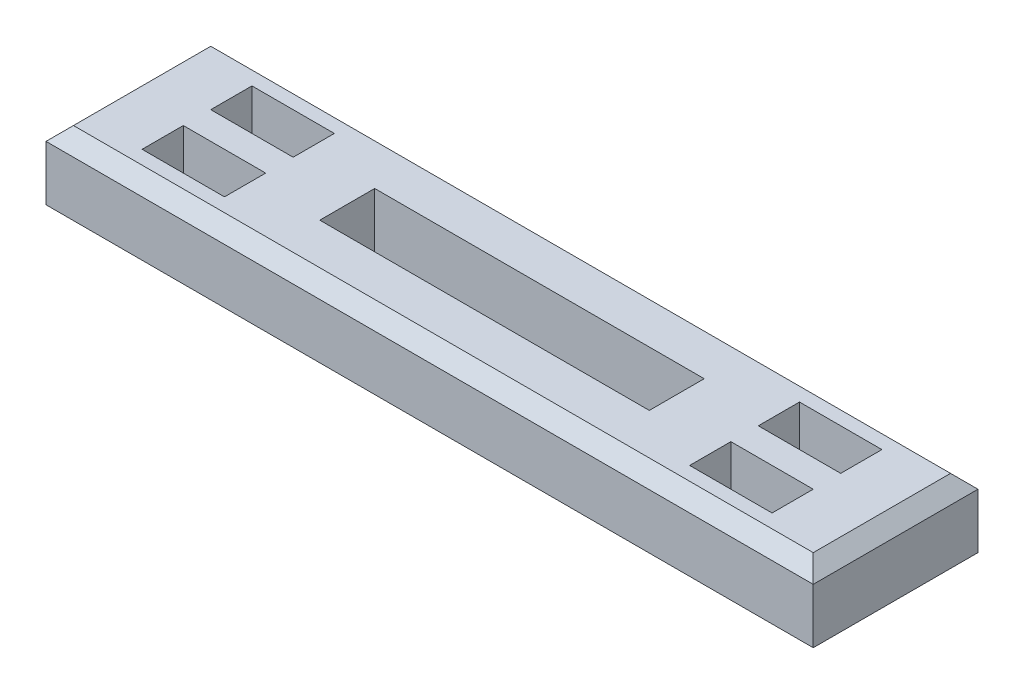
ISO-10303-21;
HEADER;
FILE_DESCRIPTION(('STEP AP214'),'2;1');
FILE_NAME('part.step','',(''),(''),'','','');
FILE_SCHEMA(('AUTOMOTIVE_DESIGN { 1 0 10303 214 1 1 1 1 }'));
ENDSEC;
DATA;
#1=APPLICATION_CONTEXT('core data for automotive mechanical design processes');
#2=APPLICATION_PROTOCOL_DEFINITION('international standard','automotive_design',2000,#1);
#3=PRODUCT_CONTEXT('',#1,'mechanical');
#4=PRODUCT('Part','Part','',(#3));
#5=PRODUCT_RELATED_PRODUCT_CATEGORY('part','',(#4));
#6=PRODUCT_DEFINITION_FORMATION('','',#4);
#7=PRODUCT_DEFINITION_CONTEXT('part definition',#1,'design');
#8=PRODUCT_DEFINITION('design','',#6,#7);
#9=PRODUCT_DEFINITION_SHAPE('','',#8);
#10=(LENGTH_UNIT() NAMED_UNIT(*) SI_UNIT(.MILLI.,.METRE.));
#11=(NAMED_UNIT(*) PLANE_ANGLE_UNIT() SI_UNIT($,.RADIAN.));
#12=(NAMED_UNIT(*) SI_UNIT($,.STERADIAN.) SOLID_ANGLE_UNIT());
#13=UNCERTAINTY_MEASURE_WITH_UNIT(LENGTH_MEASURE(1.E-05),#10,'distance_accuracy_value','');
#14=(GEOMETRIC_REPRESENTATION_CONTEXT(3) GLOBAL_UNCERTAINTY_ASSIGNED_CONTEXT((#13)) GLOBAL_UNIT_ASSIGNED_CONTEXT((#10,
#11,#12)) REPRESENTATION_CONTEXT('',''));
#15=CARTESIAN_POINT('',(0.,0.,0.));
#16=DIRECTION('',(0.,0.,1.));
#17=DIRECTION('',(1.,0.,0.));
#18=AXIS2_PLACEMENT_3D('',#15,#16,#17);
#19=CARTESIAN_POINT('',(-13.97,1.5,6.));
#20=DIRECTION('',(0.,-1.,0.));
#21=DIRECTION('',(0.,0.,-1.));
#22=AXIS2_PLACEMENT_3D('',#19,#20,#21);
#23=PLANE('',#22);
#24=DIRECTION('',(1.,0.,0.));
#25=VECTOR('',#24,1.);
#26=CARTESIAN_POINT('',(6.,1.5,4.));
#27=LINE('',#26,#25);
#28=CARTESIAN_POINT('',(-6.,1.5,4.));
#29=VERTEX_POINT('',#28);
#30=CARTESIAN_POINT('',(6.,1.5,4.));
#31=VERTEX_POINT('',#30);
#32=EDGE_CURVE('E248',#29,#31,#27,.T.);
#33=ORIENTED_EDGE('',*,*,#32,.F.);
#34=DIRECTION('',(0.,0.,1.));
#35=VECTOR('',#34,1.);
#36=CARTESIAN_POINT('',(-6.,1.5,2.));
#37=LINE('',#36,#35);
#38=CARTESIAN_POINT('',(-6.,1.5,2.));
#39=VERTEX_POINT('',#38);
#40=EDGE_CURVE('E52',#39,#29,#37,.T.);
#41=ORIENTED_EDGE('',*,*,#40,.F.);
#42=DIRECTION('',(-1.,0.,0.));
#43=VECTOR('',#42,1.);
#44=CARTESIAN_POINT('',(6.,1.5,2.));
#45=LINE('',#44,#43);
#46=CARTESIAN_POINT('',(6.,1.5,2.));
#47=VERTEX_POINT('',#46);
#48=EDGE_CURVE('E239',#47,#39,#45,.T.);
#49=ORIENTED_EDGE('',*,*,#48,.F.);
#50=DIRECTION('',(0.,0.,-1.));
#51=VECTOR('',#50,1.);
#52=CARTESIAN_POINT('',(6.,1.5,2.));
#53=LINE('',#52,#51);
#54=EDGE_CURVE('E242',#31,#47,#53,.T.);
#55=ORIENTED_EDGE('',*,*,#54,.F.);
#56=EDGE_LOOP('',(#33,#41,#49,#55));
#57=FACE_BOUND('',#56,.T.);
#58=DIRECTION('',(1.,0.,0.));
#59=VECTOR('',#58,1.);
#60=CARTESIAN_POINT('',(13.97,1.5,5.5));
#61=LINE('',#60,#59);
#62=CARTESIAN_POINT('',(-13.47,1.5,5.5));
#63=VERTEX_POINT('',#62);
#64=CARTESIAN_POINT('',(13.47,1.5,5.5));
#65=VERTEX_POINT('',#64);
#66=EDGE_CURVE('E399',#63,#65,#61,.T.);
#67=ORIENTED_EDGE('',*,*,#66,.T.);
#68=DIRECTION('',(0.,0.,-1.));
#69=VECTOR('',#68,1.);
#70=CARTESIAN_POINT('',(13.47,1.5,6.));
#71=LINE('',#70,#69);
#72=CARTESIAN_POINT('',(13.47,1.5,0.500000000000004));
#73=VERTEX_POINT('',#72);
#74=EDGE_CURVE('E401',#65,#73,#71,.T.);
#75=ORIENTED_EDGE('',*,*,#74,.T.);
#76=DIRECTION('',(-1.,0.,0.));
#77=VECTOR('',#76,1.);
#78=CARTESIAN_POINT('',(-13.97,1.5,0.500000000000004));
#79=LINE('',#78,#77);
#80=CARTESIAN_POINT('',(-13.47,1.5,0.500000000000004));
#81=VERTEX_POINT('',#80);
#82=EDGE_CURVE('E397',#73,#81,#79,.T.);
#83=ORIENTED_EDGE('',*,*,#82,.T.);
#84=DIRECTION('',(0.,0.,1.));
#85=VECTOR('',#84,1.);
#86=CARTESIAN_POINT('',(-13.47,1.5,6.));
#87=LINE('',#86,#85);
#88=EDGE_CURVE('E395',#81,#63,#87,.T.);
#89=ORIENTED_EDGE('',*,*,#88,.T.);
#90=EDGE_LOOP('',(#67,#75,#83,#89));
#91=FACE_BOUND('',#90,.T.);
#92=DIRECTION('',(-1.,0.,0.));
#93=VECTOR('',#92,1.);
#94=CARTESIAN_POINT('',(0.,1.5,5.));
#95=LINE('',#94,#93);
#96=CARTESIAN_POINT('',(11.47,1.5,5.));
#97=VERTEX_POINT('',#96);
#98=CARTESIAN_POINT('',(8.47,1.5,5.));
#99=VERTEX_POINT('',#98);
#100=EDGE_CURVE('E274',#97,#99,#95,.T.);
#101=ORIENTED_EDGE('',*,*,#100,.T.);
#102=DIRECTION('',(0.,0.,-1.));
#103=VECTOR('',#102,1.);
#104=CARTESIAN_POINT('',(8.47,1.5,0.));
#105=LINE('',#104,#103);
#106=CARTESIAN_POINT('',(8.47,1.5,3.5));
#107=VERTEX_POINT('',#106);
#108=EDGE_CURVE('E289',#99,#107,#105,.T.);
#109=ORIENTED_EDGE('',*,*,#108,.T.);
#110=DIRECTION('',(1.,0.,0.));
#111=VECTOR('',#110,1.);
#112=CARTESIAN_POINT('',(0.,1.5,3.5));
#113=LINE('',#112,#111);
#114=CARTESIAN_POINT('',(11.47,1.5,3.5));
#115=VERTEX_POINT('',#114);
#116=EDGE_CURVE('E286',#107,#115,#113,.T.);
#117=ORIENTED_EDGE('',*,*,#116,.T.);
#118=DIRECTION('',(0.,0.,-1.));
#119=VECTOR('',#118,1.);
#120=CARTESIAN_POINT('',(11.47,1.5,0.));
#121=LINE('',#120,#119);
#122=EDGE_CURVE('E283',#97,#115,#121,.T.);
#123=ORIENTED_EDGE('',*,*,#122,.F.);
#124=EDGE_LOOP('',(#101,#109,#117,#123));
#125=FACE_BOUND('',#124,.T.);
#126=DIRECTION('',(-1.,0.,0.));
#127=VECTOR('',#126,1.);
#128=CARTESIAN_POINT('',(0.,1.5,3.5));
#129=LINE('',#128,#127);
#130=CARTESIAN_POINT('',(-8.47,1.5,3.5));
#131=VERTEX_POINT('',#130);
#132=CARTESIAN_POINT('',(-11.47,1.5,3.5));
#133=VERTEX_POINT('',#132);
#134=EDGE_CURVE('E303',#131,#133,#129,.T.);
#135=ORIENTED_EDGE('',*,*,#134,.F.);
#136=DIRECTION('',(0.,0.,-1.));
#137=VECTOR('',#136,1.);
#138=CARTESIAN_POINT('',(-8.47,1.5,0.));
#139=LINE('',#138,#137);
#140=CARTESIAN_POINT('',(-8.47,1.5,5.));
#141=VERTEX_POINT('',#140);
#142=EDGE_CURVE('E295',#141,#131,#139,.T.);
#143=ORIENTED_EDGE('',*,*,#142,.F.);
#144=DIRECTION('',(1.,0.,0.));
#145=VECTOR('',#144,1.);
#146=CARTESIAN_POINT('',(0.,1.5,5.));
#147=LINE('',#146,#145);
#148=CARTESIAN_POINT('',(-11.47,1.5,5.));
#149=VERTEX_POINT('',#148);
#150=EDGE_CURVE('E309',#149,#141,#147,.T.);
#151=ORIENTED_EDGE('',*,*,#150,.F.);
#152=DIRECTION('',(0.,0.,-1.));
#153=VECTOR('',#152,1.);
#154=CARTESIAN_POINT('',(-11.47,1.5,0.));
#155=LINE('',#154,#153);
#156=EDGE_CURVE('E306',#149,#133,#155,.T.);
#157=ORIENTED_EDGE('',*,*,#156,.T.);
#158=EDGE_LOOP('',(#135,#143,#151,#157));
#159=FACE_BOUND('',#158,.T.);
#160=DIRECTION('',(-1.,0.,0.));
#161=VECTOR('',#160,1.);
#162=CARTESIAN_POINT('',(0.,1.5,0.999999999999999));
#163=LINE('',#162,#161);
#164=CARTESIAN_POINT('',(-8.47,1.5,1.));
#165=VERTEX_POINT('',#164);
#166=CARTESIAN_POINT('',(-11.47,1.5,1.));
#167=VERTEX_POINT('',#166);
#168=EDGE_CURVE('E323',#165,#167,#163,.T.);
#169=ORIENTED_EDGE('',*,*,#168,.F.);
#170=DIRECTION('',(0.,0.,-1.));
#171=VECTOR('',#170,1.);
#172=CARTESIAN_POINT('',(-8.47,1.5,0.));
#173=LINE('',#172,#171);
#174=CARTESIAN_POINT('',(-8.47,1.5,2.5));
#175=VERTEX_POINT('',#174);
#176=EDGE_CURVE('E315',#175,#165,#173,.T.);
#177=ORIENTED_EDGE('',*,*,#176,.F.);
#178=DIRECTION('',(1.,0.,0.));
#179=VECTOR('',#178,1.);
#180=CARTESIAN_POINT('',(0.,1.5,2.5));
#181=LINE('',#180,#179);
#182=CARTESIAN_POINT('',(-11.47,1.5,2.5));
#183=VERTEX_POINT('',#182);
#184=EDGE_CURVE('E329',#183,#175,#181,.T.);
#185=ORIENTED_EDGE('',*,*,#184,.F.);
#186=DIRECTION('',(0.,0.,-1.));
#187=VECTOR('',#186,1.);
#188=CARTESIAN_POINT('',(-11.47,1.5,0.));
#189=LINE('',#188,#187);
#190=EDGE_CURVE('E326',#183,#167,#189,.T.);
#191=ORIENTED_EDGE('',*,*,#190,.T.);
#192=EDGE_LOOP('',(#169,#177,#185,#191));
#193=FACE_BOUND('',#192,.T.);
#194=DIRECTION('',(-1.,0.,0.));
#195=VECTOR('',#194,1.);
#196=CARTESIAN_POINT('',(0.,1.5,2.5));
#197=LINE('',#196,#195);
#198=CARTESIAN_POINT('',(11.47,1.5,2.5));
#199=VERTEX_POINT('',#198);
#200=CARTESIAN_POINT('',(8.47,1.5,2.5));
#201=VERTEX_POINT('',#200);
#202=EDGE_CURVE('E258',#199,#201,#197,.T.);
#203=ORIENTED_EDGE('',*,*,#202,.T.);
#204=DIRECTION('',(0.,0.,-1.));
#205=VECTOR('',#204,1.);
#206=CARTESIAN_POINT('',(8.47,1.5,0.));
#207=LINE('',#206,#205);
#208=CARTESIAN_POINT('',(8.47,1.5,1.));
#209=VERTEX_POINT('',#208);
#210=EDGE_CURVE('E268',#201,#209,#207,.T.);
#211=ORIENTED_EDGE('',*,*,#210,.T.);
#212=DIRECTION('',(1.,0.,0.));
#213=VECTOR('',#212,1.);
#214=CARTESIAN_POINT('',(0.,1.5,0.999999999999999));
#215=LINE('',#214,#213);
#216=CARTESIAN_POINT('',(11.47,1.5,1.));
#217=VERTEX_POINT('',#216);
#218=EDGE_CURVE('E265',#209,#217,#215,.T.);
#219=ORIENTED_EDGE('',*,*,#218,.T.);
#220=DIRECTION('',(0.,0.,-1.));
#221=VECTOR('',#220,1.);
#222=CARTESIAN_POINT('',(11.47,1.5,0.));
#223=LINE('',#222,#221);
#224=EDGE_CURVE('E261',#199,#217,#223,.T.);
#225=ORIENTED_EDGE('',*,*,#224,.F.);
#226=EDGE_LOOP('',(#203,#211,#219,#225));
#227=FACE_BOUND('',#226,.T.);
#228=ADVANCED_FACE('F35',(#57,#91,#125,#159,#193,#227),#23,.F.);
#229=CARTESIAN_POINT('',(-13.97,-1.5,6.));
#230=DIRECTION('',(0.,1.,0.));
#231=DIRECTION('',(0.,0.,1.));
#232=AXIS2_PLACEMENT_3D('',#229,#230,#231);
#233=PLANE('',#232);
#234=DIRECTION('',(-1.,0.,0.));
#235=VECTOR('',#234,1.);
#236=CARTESIAN_POINT('',(6.,-1.5,2.));
#237=LINE('',#236,#235);
#238=CARTESIAN_POINT('',(6.,-1.5,2.));
#239=VERTEX_POINT('',#238);
#240=CARTESIAN_POINT('',(-6.,-1.5,2.));
#241=VERTEX_POINT('',#240);
#242=EDGE_CURVE('E229',#239,#241,#237,.T.);
#243=ORIENTED_EDGE('',*,*,#242,.T.);
#244=DIRECTION('',(0.,0.,1.));
#245=VECTOR('',#244,1.);
#246=CARTESIAN_POINT('',(-6.,-1.5,2.));
#247=LINE('',#246,#245);
#248=CARTESIAN_POINT('',(-6.,-1.5,4.));
#249=VERTEX_POINT('',#248);
#250=EDGE_CURVE('E223',#241,#249,#247,.T.);
#251=ORIENTED_EDGE('',*,*,#250,.T.);
#252=DIRECTION('',(1.,0.,0.));
#253=VECTOR('',#252,1.);
#254=CARTESIAN_POINT('',(6.,-1.5,4.));
#255=LINE('',#254,#253);
#256=CARTESIAN_POINT('',(6.,-1.5,4.));
#257=VERTEX_POINT('',#256);
#258=EDGE_CURVE('E232',#249,#257,#255,.T.);
#259=ORIENTED_EDGE('',*,*,#258,.T.);
#260=DIRECTION('',(0.,0.,-1.));
#261=VECTOR('',#260,1.);
#262=CARTESIAN_POINT('',(6.,-1.5,2.));
#263=LINE('',#262,#261);
#264=EDGE_CURVE('E60',#257,#239,#263,.T.);
#265=ORIENTED_EDGE('',*,*,#264,.T.);
#266=EDGE_LOOP('',(#243,#251,#259,#265));
#267=FACE_BOUND('',#266,.T.);
#268=DIRECTION('',(-1.,0.,0.));
#269=VECTOR('',#268,1.);
#270=CARTESIAN_POINT('',(-13.97,-1.5,5.5));
#271=LINE('',#270,#269);
#272=CARTESIAN_POINT('',(13.47,-1.5,5.5));
#273=VERTEX_POINT('',#272);
#274=CARTESIAN_POINT('',(-13.47,-1.5,5.5));
#275=VERTEX_POINT('',#274);
#276=EDGE_CURVE('E414',#273,#275,#271,.T.);
#277=ORIENTED_EDGE('',*,*,#276,.T.);
#278=DIRECTION('',(0.,0.,-1.));
#279=VECTOR('',#278,1.);
#280=CARTESIAN_POINT('',(-13.47,-1.5,6.));
#281=LINE('',#280,#279);
#282=CARTESIAN_POINT('',(-13.47,-1.5,0.500000000000004));
#283=VERTEX_POINT('',#282);
#284=EDGE_CURVE('E430',#275,#283,#281,.T.);
#285=ORIENTED_EDGE('',*,*,#284,.T.);
#286=DIRECTION('',(1.,0.,0.));
#287=VECTOR('',#286,1.);
#288=CARTESIAN_POINT('',(-13.97,-1.5,0.500000000000004));
#289=LINE('',#288,#287);
#290=CARTESIAN_POINT('',(13.47,-1.5,0.500000000000004));
#291=VERTEX_POINT('',#290);
#292=EDGE_CURVE('E428',#283,#291,#289,.T.);
#293=ORIENTED_EDGE('',*,*,#292,.T.);
#294=DIRECTION('',(0.,0.,1.));
#295=VECTOR('',#294,1.);
#296=CARTESIAN_POINT('',(13.47,-1.5,6.));
#297=LINE('',#296,#295);
#298=EDGE_CURVE('E426',#291,#273,#297,.T.);
#299=ORIENTED_EDGE('',*,*,#298,.T.);
#300=EDGE_LOOP('',(#277,#285,#293,#299));
#301=FACE_BOUND('',#300,.T.);
#302=DIRECTION('',(-1.,0.,0.));
#303=VECTOR('',#302,1.);
#304=CARTESIAN_POINT('',(-13.97,-1.5,5.));
#305=LINE('',#304,#303);
#306=CARTESIAN_POINT('',(11.47,-1.5,5.));
#307=VERTEX_POINT('',#306);
#308=CARTESIAN_POINT('',(8.47,-1.5,5.));
#309=VERTEX_POINT('',#308);
#310=EDGE_CURVE('E383',#307,#309,#305,.T.);
#311=ORIENTED_EDGE('',*,*,#310,.F.);
#312=DIRECTION('',(0.,0.,-1.));
#313=VECTOR('',#312,1.);
#314=CARTESIAN_POINT('',(11.47,-1.5,6.00000000000001));
#315=LINE('',#314,#313);
#316=CARTESIAN_POINT('',(11.47,-1.5,3.5));
#317=VERTEX_POINT('',#316);
#318=EDGE_CURVE('E375',#307,#317,#315,.T.);
#319=ORIENTED_EDGE('',*,*,#318,.T.);
#320=DIRECTION('',(1.,0.,0.));
#321=VECTOR('',#320,1.);
#322=CARTESIAN_POINT('',(-13.97,-1.5,3.5));
#323=LINE('',#322,#321);
#324=CARTESIAN_POINT('',(8.47,-1.5,3.5));
#325=VERTEX_POINT('',#324);
#326=EDGE_CURVE('E378',#325,#317,#323,.T.);
#327=ORIENTED_EDGE('',*,*,#326,.F.);
#328=DIRECTION('',(0.,0.,-1.));
#329=VECTOR('',#328,1.);
#330=CARTESIAN_POINT('',(8.47,-1.5,6.));
#331=LINE('',#330,#329);
#332=EDGE_CURVE('E381',#309,#325,#331,.T.);
#333=ORIENTED_EDGE('',*,*,#332,.F.);
#334=EDGE_LOOP('',(#311,#319,#327,#333));
#335=FACE_BOUND('',#334,.T.);
#336=DIRECTION('',(1.,0.,0.));
#337=VECTOR('',#336,1.);
#338=CARTESIAN_POINT('',(-13.97,-1.5,5.));
#339=LINE('',#338,#337);
#340=CARTESIAN_POINT('',(-11.47,-1.5,5.));
#341=VERTEX_POINT('',#340);
#342=CARTESIAN_POINT('',(-8.47,-1.5,5.));
#343=VERTEX_POINT('',#342);
#344=EDGE_CURVE('E369',#341,#343,#339,.T.);
#345=ORIENTED_EDGE('',*,*,#344,.T.);
#346=DIRECTION('',(0.,0.,-1.));
#347=VECTOR('',#346,1.);
#348=CARTESIAN_POINT('',(-8.47,-1.5,6.));
#349=LINE('',#348,#347);
#350=CARTESIAN_POINT('',(-8.47,-1.5,3.5));
#351=VERTEX_POINT('',#350);
#352=EDGE_CURVE('E372',#343,#351,#349,.T.);
#353=ORIENTED_EDGE('',*,*,#352,.T.);
#354=DIRECTION('',(-1.,0.,0.));
#355=VECTOR('',#354,1.);
#356=CARTESIAN_POINT('',(-13.97,-1.5,3.5));
#357=LINE('',#356,#355);
#358=CARTESIAN_POINT('',(-11.47,-1.5,3.5));
#359=VERTEX_POINT('',#358);
#360=EDGE_CURVE('E363',#351,#359,#357,.T.);
#361=ORIENTED_EDGE('',*,*,#360,.T.);
#362=DIRECTION('',(0.,0.,-1.));
#363=VECTOR('',#362,1.);
#364=CARTESIAN_POINT('',(-11.47,-1.5,6.));
#365=LINE('',#364,#363);
#366=EDGE_CURVE('E366',#341,#359,#365,.T.);
#367=ORIENTED_EDGE('',*,*,#366,.F.);
#368=EDGE_LOOP('',(#345,#353,#361,#367));
#369=FACE_BOUND('',#368,.T.);
#370=DIRECTION('',(1.,0.,0.));
#371=VECTOR('',#370,1.);
#372=CARTESIAN_POINT('',(-13.97,-1.5,2.5));
#373=LINE('',#372,#371);
#374=CARTESIAN_POINT('',(-11.47,-1.5,2.5));
#375=VERTEX_POINT('',#374);
#376=CARTESIAN_POINT('',(-8.47,-1.5,2.5));
#377=VERTEX_POINT('',#376);
#378=EDGE_CURVE('E357',#375,#377,#373,.T.);
#379=ORIENTED_EDGE('',*,*,#378,.T.);
#380=DIRECTION('',(0.,0.,-1.));
#381=VECTOR('',#380,1.);
#382=CARTESIAN_POINT('',(-8.47,-1.5,6.));
#383=LINE('',#382,#381);
#384=CARTESIAN_POINT('',(-8.47,-1.5,1.));
#385=VERTEX_POINT('',#384);
#386=EDGE_CURVE('E360',#377,#385,#383,.T.);
#387=ORIENTED_EDGE('',*,*,#386,.T.);
#388=DIRECTION('',(-1.,0.,0.));
#389=VECTOR('',#388,1.);
#390=CARTESIAN_POINT('',(-13.97,-1.5,1.));
#391=LINE('',#390,#389);
#392=CARTESIAN_POINT('',(-11.47,-1.5,1.));
#393=VERTEX_POINT('',#392);
#394=EDGE_CURVE('E348',#385,#393,#391,.T.);
#395=ORIENTED_EDGE('',*,*,#394,.T.);
#396=DIRECTION('',(0.,0.,-1.));
#397=VECTOR('',#396,1.);
#398=CARTESIAN_POINT('',(-11.47,-1.5,6.));
#399=LINE('',#398,#397);
#400=EDGE_CURVE('E354',#375,#393,#399,.T.);
#401=ORIENTED_EDGE('',*,*,#400,.F.);
#402=EDGE_LOOP('',(#379,#387,#395,#401));
#403=FACE_BOUND('',#402,.T.);
#404=DIRECTION('',(-1.,0.,0.));
#405=VECTOR('',#404,1.);
#406=CARTESIAN_POINT('',(-13.97,-1.5,2.5));
#407=LINE('',#406,#405);
#408=CARTESIAN_POINT('',(11.47,-1.5,2.5));
#409=VERTEX_POINT('',#408);
#410=CARTESIAN_POINT('',(8.47,-1.5,2.5));
#411=VERTEX_POINT('',#410);
#412=EDGE_CURVE('E393',#409,#411,#407,.T.);
#413=ORIENTED_EDGE('',*,*,#412,.F.);
#414=DIRECTION('',(0.,0.,-1.));
#415=VECTOR('',#414,1.);
#416=CARTESIAN_POINT('',(11.47,-1.5,6.00000000000001));
#417=LINE('',#416,#415);
#418=CARTESIAN_POINT('',(11.47,-1.5,1.));
#419=VERTEX_POINT('',#418);
#420=EDGE_CURVE('E385',#409,#419,#417,.T.);
#421=ORIENTED_EDGE('',*,*,#420,.T.);
#422=DIRECTION('',(1.,0.,0.));
#423=VECTOR('',#422,1.);
#424=CARTESIAN_POINT('',(-13.97,-1.5,0.999999999999997));
#425=LINE('',#424,#423);
#426=CARTESIAN_POINT('',(8.47,-1.5,1.));
#427=VERTEX_POINT('',#426);
#428=EDGE_CURVE('E388',#427,#419,#425,.T.);
#429=ORIENTED_EDGE('',*,*,#428,.F.);
#430=DIRECTION('',(0.,0.,-1.));
#431=VECTOR('',#430,1.);
#432=CARTESIAN_POINT('',(8.47,-1.5,6.));
#433=LINE('',#432,#431);
#434=EDGE_CURVE('E391',#411,#427,#433,.T.);
#435=ORIENTED_EDGE('',*,*,#434,.F.);
#436=EDGE_LOOP('',(#413,#421,#429,#435));
#437=FACE_BOUND('',#436,.T.);
#438=ADVANCED_FACE('F236',(#267,#301,#335,#369,#403,#437),#233,.F.);
#439=CARTESIAN_POINT('',(13.97,1.5,6.));
#440=DIRECTION('',(-1.,0.,0.));
#441=DIRECTION('',(0.,-1.,0.));
#442=AXIS2_PLACEMENT_3D('',#439,#440,#441);
#443=PLANE('',#442);
#444=DIRECTION('',(0.,1.,0.));
#445=VECTOR('',#444,1.);
#446=CARTESIAN_POINT('',(13.97,1.5,6.));
#447=LINE('',#446,#445);
#448=CARTESIAN_POINT('',(13.97,-0.999999999999999,6.));
#449=VERTEX_POINT('',#448);
#450=CARTESIAN_POINT('',(13.97,1.,6.));
#451=VERTEX_POINT('',#450);
#452=EDGE_CURVE('E342',#449,#451,#447,.T.);
#453=ORIENTED_EDGE('',*,*,#452,.F.);
#454=DIRECTION('',(0.,0.,-1.));
#455=VECTOR('',#454,1.);
#456=CARTESIAN_POINT('',(13.97,-0.999999999999999,6.));
#457=LINE('',#456,#455);
#458=CARTESIAN_POINT('',(13.97,-0.999999999999999,0.));
#459=VERTEX_POINT('',#458);
#460=EDGE_CURVE('E44',#449,#459,#457,.T.);
#461=ORIENTED_EDGE('',*,*,#460,.T.);
#462=DIRECTION('',(0.,1.,0.));
#463=VECTOR('',#462,1.);
#464=CARTESIAN_POINT('',(13.97,1.5,0.));
#465=LINE('',#464,#463);
#466=CARTESIAN_POINT('',(13.97,1.,0.));
#467=VERTEX_POINT('',#466);
#468=EDGE_CURVE('E335',#459,#467,#465,.T.);
#469=ORIENTED_EDGE('',*,*,#468,.T.);
#470=DIRECTION('',(0.,0.,1.));
#471=VECTOR('',#470,1.);
#472=CARTESIAN_POINT('',(13.97,1.,6.));
#473=LINE('',#472,#471);
#474=EDGE_CURVE('E404',#467,#451,#473,.T.);
#475=ORIENTED_EDGE('',*,*,#474,.T.);
#476=EDGE_LOOP('',(#453,#461,#469,#475));
#477=FACE_BOUND('',#476,.T.);
#478=ADVANCED_FACE('F460',(#477),#443,.F.);
#479=CARTESIAN_POINT('',(-13.97,1.5,6.));
#480=DIRECTION('',(1.,0.,0.));
#481=DIRECTION('',(0.,0.,-1.));
#482=AXIS2_PLACEMENT_3D('',#479,#480,#481);
#483=PLANE('',#482);
#484=DIRECTION('',(0.,-1.,0.));
#485=VECTOR('',#484,1.);
#486=CARTESIAN_POINT('',(-13.97,1.5,0.));
#487=LINE('',#486,#485);
#488=CARTESIAN_POINT('',(-13.97,1.,0.));
#489=VERTEX_POINT('',#488);
#490=CARTESIAN_POINT('',(-13.97,-0.999999999999999,0.));
#491=VERTEX_POINT('',#490);
#492=EDGE_CURVE('E345',#489,#491,#487,.T.);
#493=ORIENTED_EDGE('',*,*,#492,.T.);
#494=DIRECTION('',(0.,0.,1.));
#495=VECTOR('',#494,1.);
#496=CARTESIAN_POINT('',(-13.97,-0.999999999999999,6.));
#497=LINE('',#496,#495);
#498=CARTESIAN_POINT('',(-13.97,-0.999999999999999,6.));
#499=VERTEX_POINT('',#498);
#500=EDGE_CURVE('E433',#491,#499,#497,.T.);
#501=ORIENTED_EDGE('',*,*,#500,.T.);
#502=DIRECTION('',(0.,-1.,0.));
#503=VECTOR('',#502,1.);
#504=CARTESIAN_POINT('',(-13.97,1.5,6.));
#505=LINE('',#504,#503);
#506=CARTESIAN_POINT('',(-13.97,1.,6.));
#507=VERTEX_POINT('',#506);
#508=EDGE_CURVE('E344',#507,#499,#505,.T.);
#509=ORIENTED_EDGE('',*,*,#508,.F.);
#510=DIRECTION('',(0.,0.,-1.));
#511=VECTOR('',#510,1.);
#512=CARTESIAN_POINT('',(-13.97,1.,6.));
#513=LINE('',#512,#511);
#514=EDGE_CURVE('E412',#507,#489,#513,.T.);
#515=ORIENTED_EDGE('',*,*,#514,.T.);
#516=EDGE_LOOP('',(#493,#501,#509,#515));
#517=FACE_BOUND('',#516,.T.);
#518=ADVANCED_FACE('F488',(#517),#483,.F.);
#519=CARTESIAN_POINT('',(0.,0.,6.));
#520=DIRECTION('',(0.,0.,1.));
#521=DIRECTION('',(1.,0.,0.));
#522=AXIS2_PLACEMENT_3D('',#519,#520,#521);
#523=PLANE('',#522);
#524=ORIENTED_EDGE('',*,*,#508,.T.);
#525=DIRECTION('',(1.,0.,0.));
#526=VECTOR('',#525,1.);
#527=CARTESIAN_POINT('',(13.97,-0.999999999999999,6.));
#528=LINE('',#527,#526);
#529=EDGE_CURVE('E11',#499,#449,#528,.T.);
#530=ORIENTED_EDGE('',*,*,#529,.T.);
#531=ORIENTED_EDGE('',*,*,#452,.T.);
#532=DIRECTION('',(-1.,0.,0.));
#533=VECTOR('',#532,1.);
#534=CARTESIAN_POINT('',(-13.97,1.,6.));
#535=LINE('',#534,#533);
#536=EDGE_CURVE('E407',#451,#507,#535,.T.);
#537=ORIENTED_EDGE('',*,*,#536,.T.);
#538=EDGE_LOOP('',(#524,#530,#531,#537));
#539=FACE_BOUND('',#538,.T.);
#540=ADVANCED_FACE('F485',(#539),#523,.T.);
#541=CARTESIAN_POINT('',(0.,0.,0.));
#542=DIRECTION('',(0.,0.,1.));
#543=DIRECTION('',(1.,0.,0.));
#544=AXIS2_PLACEMENT_3D('',#541,#542,#543);
#545=PLANE('',#544);
#546=ORIENTED_EDGE('',*,*,#468,.F.);
#547=DIRECTION('',(-1.,0.,0.));
#548=VECTOR('',#547,1.);
#549=CARTESIAN_POINT('',(0.,-0.999999999999999,0.));
#550=LINE('',#549,#548);
#551=EDGE_CURVE('E436',#459,#491,#550,.T.);
#552=ORIENTED_EDGE('',*,*,#551,.T.);
#553=ORIENTED_EDGE('',*,*,#492,.F.);
#554=DIRECTION('',(1.,0.,0.));
#555=VECTOR('',#554,1.);
#556=CARTESIAN_POINT('',(0.,1.,0.));
#557=LINE('',#556,#555);
#558=EDGE_CURVE('E409',#489,#467,#557,.T.);
#559=ORIENTED_EDGE('',*,*,#558,.T.);
#560=EDGE_LOOP('',(#546,#552,#553,#559));
#561=FACE_BOUND('',#560,.T.);
#562=ADVANCED_FACE('F462',(#561),#545,.F.);
#563=CARTESIAN_POINT('',(-8.47,-4.5,0.));
#564=DIRECTION('',(1.,0.,0.));
#565=DIRECTION('',(0.,0.,-1.));
#566=AXIS2_PLACEMENT_3D('',#563,#564,#565);
#567=PLANE('',#566);
#568=DIRECTION('',(0.,1.,0.));
#569=VECTOR('',#568,1.);
#570=CARTESIAN_POINT('',(-8.47,-4.5,2.5));
#571=LINE('',#570,#569);
#572=EDGE_CURVE('E333',#377,#175,#571,.T.);
#573=ORIENTED_EDGE('',*,*,#572,.T.);
#574=ORIENTED_EDGE('',*,*,#176,.T.);
#575=DIRECTION('',(0.,1.,0.));
#576=VECTOR('',#575,1.);
#577=CARTESIAN_POINT('',(-8.47,-4.5,1.));
#578=LINE('',#577,#576);
#579=EDGE_CURVE('E332',#385,#165,#578,.T.);
#580=ORIENTED_EDGE('',*,*,#579,.F.);
#581=ORIENTED_EDGE('',*,*,#386,.F.);
#582=EDGE_LOOP('',(#573,#574,#580,#581));
#583=FACE_BOUND('',#582,.T.);
#584=ADVANCED_FACE('F736',(#583),#567,.F.);
#585=CARTESIAN_POINT('',(0.,-4.5,2.5));
#586=DIRECTION('',(0.,0.,1.));
#587=DIRECTION('',(1.,0.,0.));
#588=AXIS2_PLACEMENT_3D('',#585,#586,#587);
#589=PLANE('',#588);
#590=DIRECTION('',(0.,1.,0.));
#591=VECTOR('',#590,1.);
#592=CARTESIAN_POINT('',(-11.47,-4.5,2.5));
#593=LINE('',#592,#591);
#594=EDGE_CURVE('E336',#375,#183,#593,.T.);
#595=ORIENTED_EDGE('',*,*,#594,.T.);
#596=ORIENTED_EDGE('',*,*,#184,.T.);
#597=ORIENTED_EDGE('',*,*,#572,.F.);
#598=ORIENTED_EDGE('',*,*,#378,.F.);
#599=EDGE_LOOP('',(#595,#596,#597,#598));
#600=FACE_BOUND('',#599,.T.);
#601=ADVANCED_FACE('F727',(#600),#589,.F.);
#602=CARTESIAN_POINT('',(-11.47,-4.5,0.));
#603=DIRECTION('',(1.,0.,0.));
#604=DIRECTION('',(0.,0.,-1.));
#605=AXIS2_PLACEMENT_3D('',#602,#603,#604);
#606=PLANE('',#605);
#607=ORIENTED_EDGE('',*,*,#400,.T.);
#608=DIRECTION('',(0.,1.,0.));
#609=VECTOR('',#608,1.);
#610=CARTESIAN_POINT('',(-11.47,-4.5,1.));
#611=LINE('',#610,#609);
#612=EDGE_CURVE('E338',#393,#167,#611,.T.);
#613=ORIENTED_EDGE('',*,*,#612,.T.);
#614=ORIENTED_EDGE('',*,*,#190,.F.);
#615=ORIENTED_EDGE('',*,*,#594,.F.);
#616=EDGE_LOOP('',(#607,#613,#614,#615));
#617=FACE_BOUND('',#616,.T.);
#618=ADVANCED_FACE('F718',(#617),#606,.T.);
#619=CARTESIAN_POINT('',(0.,-4.5,0.999999999999999));
#620=DIRECTION('',(0.,0.,-1.));
#621=DIRECTION('',(-1.,0.,0.));
#622=AXIS2_PLACEMENT_3D('',#619,#620,#621);
#623=PLANE('',#622);
#624=ORIENTED_EDGE('',*,*,#579,.T.);
#625=ORIENTED_EDGE('',*,*,#168,.T.);
#626=ORIENTED_EDGE('',*,*,#612,.F.);
#627=ORIENTED_EDGE('',*,*,#394,.F.);
#628=EDGE_LOOP('',(#624,#625,#626,#627));
#629=FACE_BOUND('',#628,.T.);
#630=ADVANCED_FACE('F709',(#629),#623,.F.);
#631=CARTESIAN_POINT('',(-8.47,-4.5,0.));
#632=DIRECTION('',(1.,0.,0.));
#633=DIRECTION('',(0.,0.,-1.));
#634=AXIS2_PLACEMENT_3D('',#631,#632,#633);
#635=PLANE('',#634);
#636=DIRECTION('',(0.,1.,0.));
#637=VECTOR('',#636,1.);
#638=CARTESIAN_POINT('',(-8.47,-4.5,5.));
#639=LINE('',#638,#637);
#640=EDGE_CURVE('E313',#343,#141,#639,.T.);
#641=ORIENTED_EDGE('',*,*,#640,.T.);
#642=ORIENTED_EDGE('',*,*,#142,.T.);
#643=DIRECTION('',(0.,1.,0.));
#644=VECTOR('',#643,1.);
#645=CARTESIAN_POINT('',(-8.47,-4.5,3.5));
#646=LINE('',#645,#644);
#647=EDGE_CURVE('E312',#351,#131,#646,.T.);
#648=ORIENTED_EDGE('',*,*,#647,.F.);
#649=ORIENTED_EDGE('',*,*,#352,.F.);
#650=EDGE_LOOP('',(#641,#642,#648,#649));
#651=FACE_BOUND('',#650,.T.);
#652=ADVANCED_FACE('F700',(#651),#635,.F.);
#653=CARTESIAN_POINT('',(0.,-4.5,5.));
#654=DIRECTION('',(0.,0.,1.));
#655=DIRECTION('',(1.,0.,0.));
#656=AXIS2_PLACEMENT_3D('',#653,#654,#655);
#657=PLANE('',#656);
#658=DIRECTION('',(0.,1.,0.));
#659=VECTOR('',#658,1.);
#660=CARTESIAN_POINT('',(-11.47,-4.5,5.));
#661=LINE('',#660,#659);
#662=EDGE_CURVE('E316',#341,#149,#661,.T.);
#663=ORIENTED_EDGE('',*,*,#662,.T.);
#664=ORIENTED_EDGE('',*,*,#150,.T.);
#665=ORIENTED_EDGE('',*,*,#640,.F.);
#666=ORIENTED_EDGE('',*,*,#344,.F.);
#667=EDGE_LOOP('',(#663,#664,#665,#666));
#668=FACE_BOUND('',#667,.T.);
#669=ADVANCED_FACE('F691',(#668),#657,.F.);
#670=CARTESIAN_POINT('',(-11.47,-4.5,0.));
#671=DIRECTION('',(1.,0.,0.));
#672=DIRECTION('',(0.,0.,-1.));
#673=AXIS2_PLACEMENT_3D('',#670,#671,#672);
#674=PLANE('',#673);
#675=ORIENTED_EDGE('',*,*,#366,.T.);
#676=DIRECTION('',(0.,1.,0.));
#677=VECTOR('',#676,1.);
#678=CARTESIAN_POINT('',(-11.47,-4.5,3.5));
#679=LINE('',#678,#677);
#680=EDGE_CURVE('E318',#359,#133,#679,.T.);
#681=ORIENTED_EDGE('',*,*,#680,.T.);
#682=ORIENTED_EDGE('',*,*,#156,.F.);
#683=ORIENTED_EDGE('',*,*,#662,.F.);
#684=EDGE_LOOP('',(#675,#681,#682,#683));
#685=FACE_BOUND('',#684,.T.);
#686=ADVANCED_FACE('F682',(#685),#674,.T.);
#687=CARTESIAN_POINT('',(0.,-4.5,3.5));
#688=DIRECTION('',(0.,0.,-1.));
#689=DIRECTION('',(-1.,0.,0.));
#690=AXIS2_PLACEMENT_3D('',#687,#688,#689);
#691=PLANE('',#690);
#692=ORIENTED_EDGE('',*,*,#647,.T.);
#693=ORIENTED_EDGE('',*,*,#134,.T.);
#694=ORIENTED_EDGE('',*,*,#680,.F.);
#695=ORIENTED_EDGE('',*,*,#360,.F.);
#696=EDGE_LOOP('',(#692,#693,#694,#695));
#697=FACE_BOUND('',#696,.T.);
#698=ADVANCED_FACE('F673',(#697),#691,.F.);
#699=CARTESIAN_POINT('',(0.,-4.5,5.));
#700=DIRECTION('',(0.,0.,-1.));
#701=DIRECTION('',(-1.,0.,0.));
#702=AXIS2_PLACEMENT_3D('',#699,#700,#701);
#703=PLANE('',#702);
#704=ORIENTED_EDGE('',*,*,#310,.T.);
#705=DIRECTION('',(0.,1.,0.));
#706=VECTOR('',#705,1.);
#707=CARTESIAN_POINT('',(8.47,-4.5,5.));
#708=LINE('',#707,#706);
#709=EDGE_CURVE('E293',#309,#99,#708,.T.);
#710=ORIENTED_EDGE('',*,*,#709,.T.);
#711=ORIENTED_EDGE('',*,*,#100,.F.);
#712=DIRECTION('',(0.,1.,0.));
#713=VECTOR('',#712,1.);
#714=CARTESIAN_POINT('',(11.47,-4.5,5.));
#715=LINE('',#714,#713);
#716=EDGE_CURVE('E292',#307,#97,#715,.T.);
#717=ORIENTED_EDGE('',*,*,#716,.F.);
#718=EDGE_LOOP('',(#704,#710,#711,#717));
#719=FACE_BOUND('',#718,.T.);
#720=ADVANCED_FACE('F664',(#719),#703,.T.);
#721=CARTESIAN_POINT('',(8.47,-4.5,0.));
#722=DIRECTION('',(1.,0.,0.));
#723=DIRECTION('',(0.,0.,-1.));
#724=AXIS2_PLACEMENT_3D('',#721,#722,#723);
#725=PLANE('',#724);
#726=ORIENTED_EDGE('',*,*,#332,.T.);
#727=DIRECTION('',(0.,1.,0.));
#728=VECTOR('',#727,1.);
#729=CARTESIAN_POINT('',(8.47,-4.5,3.5));
#730=LINE('',#729,#728);
#731=EDGE_CURVE('E296',#325,#107,#730,.T.);
#732=ORIENTED_EDGE('',*,*,#731,.T.);
#733=ORIENTED_EDGE('',*,*,#108,.F.);
#734=ORIENTED_EDGE('',*,*,#709,.F.);
#735=EDGE_LOOP('',(#726,#732,#733,#734));
#736=FACE_BOUND('',#735,.T.);
#737=ADVANCED_FACE('F655',(#736),#725,.T.);
#738=CARTESIAN_POINT('',(0.,-4.5,3.5));
#739=DIRECTION('',(0.,0.,1.));
#740=DIRECTION('',(1.,0.,0.));
#741=AXIS2_PLACEMENT_3D('',#738,#739,#740);
#742=PLANE('',#741);
#743=ORIENTED_EDGE('',*,*,#326,.T.);
#744=DIRECTION('',(0.,1.,0.));
#745=VECTOR('',#744,1.);
#746=CARTESIAN_POINT('',(11.47,-4.5,3.5));
#747=LINE('',#746,#745);
#748=EDGE_CURVE('E298',#317,#115,#747,.T.);
#749=ORIENTED_EDGE('',*,*,#748,.T.);
#750=ORIENTED_EDGE('',*,*,#116,.F.);
#751=ORIENTED_EDGE('',*,*,#731,.F.);
#752=EDGE_LOOP('',(#743,#749,#750,#751));
#753=FACE_BOUND('',#752,.T.);
#754=ADVANCED_FACE('F646',(#753),#742,.T.);
#755=CARTESIAN_POINT('',(11.47,-4.5,0.));
#756=DIRECTION('',(1.,0.,0.));
#757=DIRECTION('',(0.,0.,-1.));
#758=AXIS2_PLACEMENT_3D('',#755,#756,#757);
#759=PLANE('',#758);
#760=ORIENTED_EDGE('',*,*,#716,.T.);
#761=ORIENTED_EDGE('',*,*,#122,.T.);
#762=ORIENTED_EDGE('',*,*,#748,.F.);
#763=ORIENTED_EDGE('',*,*,#318,.F.);
#764=EDGE_LOOP('',(#760,#761,#762,#763));
#765=FACE_BOUND('',#764,.T.);
#766=ADVANCED_FACE('F637',(#765),#759,.F.);
#767=CARTESIAN_POINT('',(0.,-4.5,2.5));
#768=DIRECTION('',(0.,0.,-1.));
#769=DIRECTION('',(-1.,0.,0.));
#770=AXIS2_PLACEMENT_3D('',#767,#768,#769);
#771=PLANE('',#770);
#772=ORIENTED_EDGE('',*,*,#412,.T.);
#773=DIRECTION('',(0.,1.,0.));
#774=VECTOR('',#773,1.);
#775=CARTESIAN_POINT('',(8.47,-4.5,2.5));
#776=LINE('',#775,#774);
#777=EDGE_CURVE('E272',#411,#201,#776,.T.);
#778=ORIENTED_EDGE('',*,*,#777,.T.);
#779=ORIENTED_EDGE('',*,*,#202,.F.);
#780=DIRECTION('',(0.,1.,0.));
#781=VECTOR('',#780,1.);
#782=CARTESIAN_POINT('',(11.47,-4.5,2.5));
#783=LINE('',#782,#781);
#784=EDGE_CURVE('E271',#409,#199,#783,.T.);
#785=ORIENTED_EDGE('',*,*,#784,.F.);
#786=EDGE_LOOP('',(#772,#778,#779,#785));
#787=FACE_BOUND('',#786,.T.);
#788=ADVANCED_FACE('F628',(#787),#771,.T.);
#789=CARTESIAN_POINT('',(8.47,-4.5,0.));
#790=DIRECTION('',(1.,0.,0.));
#791=DIRECTION('',(0.,0.,-1.));
#792=AXIS2_PLACEMENT_3D('',#789,#790,#791);
#793=PLANE('',#792);
#794=ORIENTED_EDGE('',*,*,#434,.T.);
#795=DIRECTION('',(0.,1.,0.));
#796=VECTOR('',#795,1.);
#797=CARTESIAN_POINT('',(8.47,-4.5,1.));
#798=LINE('',#797,#796);
#799=EDGE_CURVE('E275',#427,#209,#798,.T.);
#800=ORIENTED_EDGE('',*,*,#799,.T.);
#801=ORIENTED_EDGE('',*,*,#210,.F.);
#802=ORIENTED_EDGE('',*,*,#777,.F.);
#803=EDGE_LOOP('',(#794,#800,#801,#802));
#804=FACE_BOUND('',#803,.T.);
#805=ADVANCED_FACE('F619',(#804),#793,.T.);
#806=CARTESIAN_POINT('',(0.,-4.5,0.999999999999999));
#807=DIRECTION('',(0.,0.,1.));
#808=DIRECTION('',(1.,0.,0.));
#809=AXIS2_PLACEMENT_3D('',#806,#807,#808);
#810=PLANE('',#809);
#811=ORIENTED_EDGE('',*,*,#428,.T.);
#812=DIRECTION('',(0.,1.,0.));
#813=VECTOR('',#812,1.);
#814=CARTESIAN_POINT('',(11.47,-4.5,1.));
#815=LINE('',#814,#813);
#816=EDGE_CURVE('E277',#419,#217,#815,.T.);
#817=ORIENTED_EDGE('',*,*,#816,.T.);
#818=ORIENTED_EDGE('',*,*,#218,.F.);
#819=ORIENTED_EDGE('',*,*,#799,.F.);
#820=EDGE_LOOP('',(#811,#817,#818,#819));
#821=FACE_BOUND('',#820,.T.);
#822=ADVANCED_FACE('F500',(#821),#810,.T.);
#823=CARTESIAN_POINT('',(11.47,-4.5,0.));
#824=DIRECTION('',(1.,0.,0.));
#825=DIRECTION('',(0.,0.,-1.));
#826=AXIS2_PLACEMENT_3D('',#823,#824,#825);
#827=PLANE('',#826);
#828=ORIENTED_EDGE('',*,*,#784,.T.);
#829=ORIENTED_EDGE('',*,*,#224,.T.);
#830=ORIENTED_EDGE('',*,*,#816,.F.);
#831=ORIENTED_EDGE('',*,*,#420,.F.);
#832=EDGE_LOOP('',(#828,#829,#830,#831));
#833=FACE_BOUND('',#832,.T.);
#834=ADVANCED_FACE('F493',(#833),#827,.F.);
#835=CARTESIAN_POINT('',(-13.97,1.,6.));
#836=DIRECTION('',(0.707106781186545,-0.70710678118655,0.));
#837=DIRECTION('',(0.,0.,-1.));
#838=AXIS2_PLACEMENT_3D('',#835,#836,#837);
#839=PLANE('',#838);
#840=DIRECTION('',(-0.577350269189627,-0.577350269189623,-0.577350269189627));
#841=VECTOR('',#840,1.);
#842=CARTESIAN_POINT('',(-11.97,3.,2.00000000000001));
#843=LINE('',#842,#841);
#844=EDGE_CURVE('E420',#489,#81,#843,.F.);
#845=ORIENTED_EDGE('',*,*,#844,.F.);
#846=ORIENTED_EDGE('',*,*,#514,.F.);
#847=DIRECTION('',(-0.577350269189627,-0.577350269189623,0.577350269189627));
#848=VECTOR('',#847,1.);
#849=CARTESIAN_POINT('',(-13.97,1.,6.));
#850=LINE('',#849,#848);
#851=EDGE_CURVE('E262',#63,#507,#850,.T.);
#852=ORIENTED_EDGE('',*,*,#851,.F.);
#853=ORIENTED_EDGE('',*,*,#88,.F.);
#854=EDGE_LOOP('',(#845,#846,#852,#853));
#855=FACE_BOUND('',#854,.T.);
#856=ADVANCED_FACE('F491',(#855),#839,.F.);
#857=CARTESIAN_POINT('',(0.,1.,6.));
#858=DIRECTION('',(0.,0.70710678118655,0.707106781186545));
#859=DIRECTION('',(1.,0.,0.));
#860=AXIS2_PLACEMENT_3D('',#857,#858,#859);
#861=PLANE('',#860);
#862=ORIENTED_EDGE('',*,*,#851,.T.);
#863=ORIENTED_EDGE('',*,*,#536,.F.);
#864=DIRECTION('',(0.577350269189627,-0.577350269189623,0.577350269189627));
#865=VECTOR('',#864,1.);
#866=CARTESIAN_POINT('',(9.31333333333332,5.65666666666665,1.34333333333331));
#867=LINE('',#866,#865);
#868=EDGE_CURVE('E417',#65,#451,#867,.T.);
#869=ORIENTED_EDGE('',*,*,#868,.F.);
#870=ORIENTED_EDGE('',*,*,#66,.F.);
#871=EDGE_LOOP('',(#862,#863,#869,#870));
#872=FACE_BOUND('',#871,.T.);
#873=ADVANCED_FACE('F482',(#872),#861,.T.);
#874=CARTESIAN_POINT('',(-13.97,1.5,0.500000000000004));
#875=DIRECTION('',(0.,-0.70710678118655,0.707106781186545));
#876=DIRECTION('',(-1.,0.,0.));
#877=AXIS2_PLACEMENT_3D('',#874,#875,#876);
#878=PLANE('',#877);
#879=ORIENTED_EDGE('',*,*,#844,.T.);
#880=ORIENTED_EDGE('',*,*,#82,.F.);
#881=DIRECTION('',(0.577350269189627,-0.577350269189623,-0.577350269189627));
#882=VECTOR('',#881,1.);
#883=CARTESIAN_POINT('',(4.32333333333331,10.6466666666666,9.64666666666671));
#884=LINE('',#883,#882);
#885=EDGE_CURVE('E415',#467,#73,#884,.F.);
#886=ORIENTED_EDGE('',*,*,#885,.F.);
#887=ORIENTED_EDGE('',*,*,#558,.F.);
#888=EDGE_LOOP('',(#879,#880,#886,#887));
#889=FACE_BOUND('',#888,.T.);
#890=ADVANCED_FACE('F475',(#889),#878,.F.);
#891=CARTESIAN_POINT('',(13.47,1.5,6.));
#892=DIRECTION('',(-0.707106781186546,-0.70710678118655,0.));
#893=DIRECTION('',(0.,0.,-1.));
#894=AXIS2_PLACEMENT_3D('',#891,#892,#893);
#895=PLANE('',#894);
#896=ORIENTED_EDGE('',*,*,#868,.T.);
#897=ORIENTED_EDGE('',*,*,#474,.F.);
#898=ORIENTED_EDGE('',*,*,#885,.T.);
#899=ORIENTED_EDGE('',*,*,#74,.F.);
#900=EDGE_LOOP('',(#896,#897,#898,#899));
#901=FACE_BOUND('',#900,.T.);
#902=ADVANCED_FACE('F470',(#901),#895,.F.);
#903=CARTESIAN_POINT('',(13.97,-1.,6.));
#904=DIRECTION('',(-0.707106781186544,0.707106781186551,0.));
#905=DIRECTION('',(0.,0.,-1.));
#906=AXIS2_PLACEMENT_3D('',#903,#904,#905);
#907=PLANE('',#906);
#908=DIRECTION('',(0.577350269189628,0.577350269189623,-0.577350269189627));
#909=VECTOR('',#908,1.);
#910=CARTESIAN_POINT('',(11.97,-2.99999999999999,2.00000000000001));
#911=LINE('',#910,#909);
#912=EDGE_CURVE('E441',#459,#291,#911,.F.);
#913=ORIENTED_EDGE('',*,*,#912,.F.);
#914=ORIENTED_EDGE('',*,*,#460,.F.);
#915=DIRECTION('',(-0.577350269189628,-0.577350269189623,-0.577350269189627));
#916=VECTOR('',#915,1.);
#917=CARTESIAN_POINT('',(9.3133333333333,-5.65666666666666,1.34333333333331));
#918=LINE('',#917,#916);
#919=EDGE_CURVE('E39',#273,#449,#918,.F.);
#920=ORIENTED_EDGE('',*,*,#919,.F.);
#921=ORIENTED_EDGE('',*,*,#298,.F.);
#922=EDGE_LOOP('',(#913,#914,#920,#921));
#923=FACE_BOUND('',#922,.T.);
#924=ADVANCED_FACE('F37',(#923),#907,.F.);
#925=CARTESIAN_POINT('',(0.,-0.999999999999999,6.));
#926=DIRECTION('',(0.,-0.70710678118655,0.707106781186545));
#927=DIRECTION('',(-1.,0.,0.));
#928=AXIS2_PLACEMENT_3D('',#925,#926,#927);
#929=PLANE('',#928);
#930=ORIENTED_EDGE('',*,*,#919,.T.);
#931=ORIENTED_EDGE('',*,*,#529,.F.);
#932=DIRECTION('',(-0.577350269189627,0.577350269189623,0.577350269189627));
#933=VECTOR('',#932,1.);
#934=CARTESIAN_POINT('',(-9.31333333333331,-5.65666666666666,1.34333333333331));
#935=LINE('',#934,#933);
#936=EDGE_CURVE('E440',#275,#499,#935,.T.);
#937=ORIENTED_EDGE('',*,*,#936,.F.);
#938=ORIENTED_EDGE('',*,*,#276,.F.);
#939=EDGE_LOOP('',(#930,#931,#937,#938));
#940=FACE_BOUND('',#939,.T.);
#941=ADVANCED_FACE('F452',(#940),#929,.T.);
#942=CARTESIAN_POINT('',(-13.97,-1.5,0.500000000000004));
#943=DIRECTION('',(0.,0.70710678118655,0.707106781186545));
#944=DIRECTION('',(1.,0.,0.));
#945=AXIS2_PLACEMENT_3D('',#942,#943,#944);
#946=PLANE('',#945);
#947=ORIENTED_EDGE('',*,*,#912,.T.);
#948=ORIENTED_EDGE('',*,*,#292,.F.);
#949=DIRECTION('',(-0.577350269189627,0.577350269189623,-0.577350269189627));
#950=VECTOR('',#949,1.);
#951=CARTESIAN_POINT('',(-13.6366666666667,-1.33333333333333,0.333333333333335));
#952=LINE('',#951,#950);
#953=EDGE_CURVE('E254',#491,#283,#952,.F.);
#954=ORIENTED_EDGE('',*,*,#953,.F.);
#955=ORIENTED_EDGE('',*,*,#551,.F.);
#956=EDGE_LOOP('',(#947,#948,#954,#955));
#957=FACE_BOUND('',#956,.T.);
#958=ADVANCED_FACE('F539',(#957),#946,.F.);
#959=CARTESIAN_POINT('',(-13.47,-1.5,6.));
#960=DIRECTION('',(0.707106781186545,0.70710678118655,0.));
#961=DIRECTION('',(0.,0.,-1.));
#962=AXIS2_PLACEMENT_3D('',#959,#960,#961);
#963=PLANE('',#962);
#964=ORIENTED_EDGE('',*,*,#936,.T.);
#965=ORIENTED_EDGE('',*,*,#500,.F.);
#966=ORIENTED_EDGE('',*,*,#953,.T.);
#967=ORIENTED_EDGE('',*,*,#284,.F.);
#968=EDGE_LOOP('',(#964,#965,#966,#967));
#969=FACE_BOUND('',#968,.T.);
#970=ADVANCED_FACE('F545',(#969),#963,.F.);
#971=CARTESIAN_POINT('',(-6.,-1.5,2.));
#972=DIRECTION('',(-1.,0.,0.));
#973=DIRECTION('',(0.,0.,1.));
#974=AXIS2_PLACEMENT_3D('',#971,#972,#973);
#975=PLANE('',#974);
#976=ORIENTED_EDGE('',*,*,#40,.T.);
#977=DIRECTION('',(0.,1.,0.));
#978=VECTOR('',#977,1.);
#979=CARTESIAN_POINT('',(-6.,-1.5,4.));
#980=LINE('',#979,#978);
#981=EDGE_CURVE('E219',#249,#29,#980,.T.);
#982=ORIENTED_EDGE('',*,*,#981,.F.);
#983=ORIENTED_EDGE('',*,*,#250,.F.);
#984=DIRECTION('',(0.,1.,0.));
#985=VECTOR('',#984,1.);
#986=CARTESIAN_POINT('',(-6.,-1.5,2.));
#987=LINE('',#986,#985);
#988=EDGE_CURVE('E252',#241,#39,#987,.T.);
#989=ORIENTED_EDGE('',*,*,#988,.T.);
#990=EDGE_LOOP('',(#976,#982,#983,#989));
#991=FACE_BOUND('',#990,.T.);
#992=ADVANCED_FACE('F221',(#991),#975,.F.);
#993=CARTESIAN_POINT('',(6.,-1.5,2.));
#994=DIRECTION('',(0.,0.,-1.));
#995=DIRECTION('',(-1.,0.,0.));
#996=AXIS2_PLACEMENT_3D('',#993,#994,#995);
#997=PLANE('',#996);
#998=ORIENTED_EDGE('',*,*,#48,.T.);
#999=ORIENTED_EDGE('',*,*,#988,.F.);
#1000=ORIENTED_EDGE('',*,*,#242,.F.);
#1001=DIRECTION('',(0.,1.,0.));
#1002=VECTOR('',#1001,1.);
#1003=CARTESIAN_POINT('',(6.,-1.5,2.));
#1004=LINE('',#1003,#1002);
#1005=EDGE_CURVE('E255',#239,#47,#1004,.T.);
#1006=ORIENTED_EDGE('',*,*,#1005,.T.);
#1007=EDGE_LOOP('',(#998,#999,#1000,#1006));
#1008=FACE_BOUND('',#1007,.T.);
#1009=ADVANCED_FACE('F557',(#1008),#997,.F.);
#1010=CARTESIAN_POINT('',(6.,-1.5,2.));
#1011=DIRECTION('',(1.,0.,0.));
#1012=DIRECTION('',(0.,0.,-1.));
#1013=AXIS2_PLACEMENT_3D('',#1010,#1011,#1012);
#1014=PLANE('',#1013);
#1015=ORIENTED_EDGE('',*,*,#54,.T.);
#1016=ORIENTED_EDGE('',*,*,#1005,.F.);
#1017=ORIENTED_EDGE('',*,*,#264,.F.);
#1018=DIRECTION('',(0.,1.,0.));
#1019=VECTOR('',#1018,1.);
#1020=CARTESIAN_POINT('',(6.,-1.5,4.));
#1021=LINE('',#1020,#1019);
#1022=EDGE_CURVE('E228',#257,#31,#1021,.T.);
#1023=ORIENTED_EDGE('',*,*,#1022,.T.);
#1024=EDGE_LOOP('',(#1015,#1016,#1017,#1023));
#1025=FACE_BOUND('',#1024,.T.);
#1026=ADVANCED_FACE('F564',(#1025),#1014,.F.);
#1027=CARTESIAN_POINT('',(6.,-1.5,4.));
#1028=DIRECTION('',(0.,0.,1.));
#1029=DIRECTION('',(1.,0.,0.));
#1030=AXIS2_PLACEMENT_3D('',#1027,#1028,#1029);
#1031=PLANE('',#1030);
#1032=ORIENTED_EDGE('',*,*,#32,.T.);
#1033=ORIENTED_EDGE('',*,*,#1022,.F.);
#1034=ORIENTED_EDGE('',*,*,#258,.F.);
#1035=ORIENTED_EDGE('',*,*,#981,.T.);
#1036=EDGE_LOOP('',(#1032,#1033,#1034,#1035));
#1037=FACE_BOUND('',#1036,.T.);
#1038=ADVANCED_FACE('F233',(#1037),#1031,.F.);
#1039=CLOSED_SHELL('',(#228,#438,#478,#518,#540,#562,#584,#601,#618,#630,#652,#669,#686,#698,
#720,#737,#754,#766,#788,#805,#822,#834,#856,#873,#890,#902,#924,#941,#958,#970,#992,#1009,
#1026,#1038));
#1040=MANIFOLD_SOLID_BREP('B2',#1039);
#1041=ADVANCED_BREP_SHAPE_REPRESENTATION('',(#18,#1040),#14);
#1042=SHAPE_DEFINITION_REPRESENTATION(#9,#1041);
ENDSEC;
END-ISO-10303-21;
